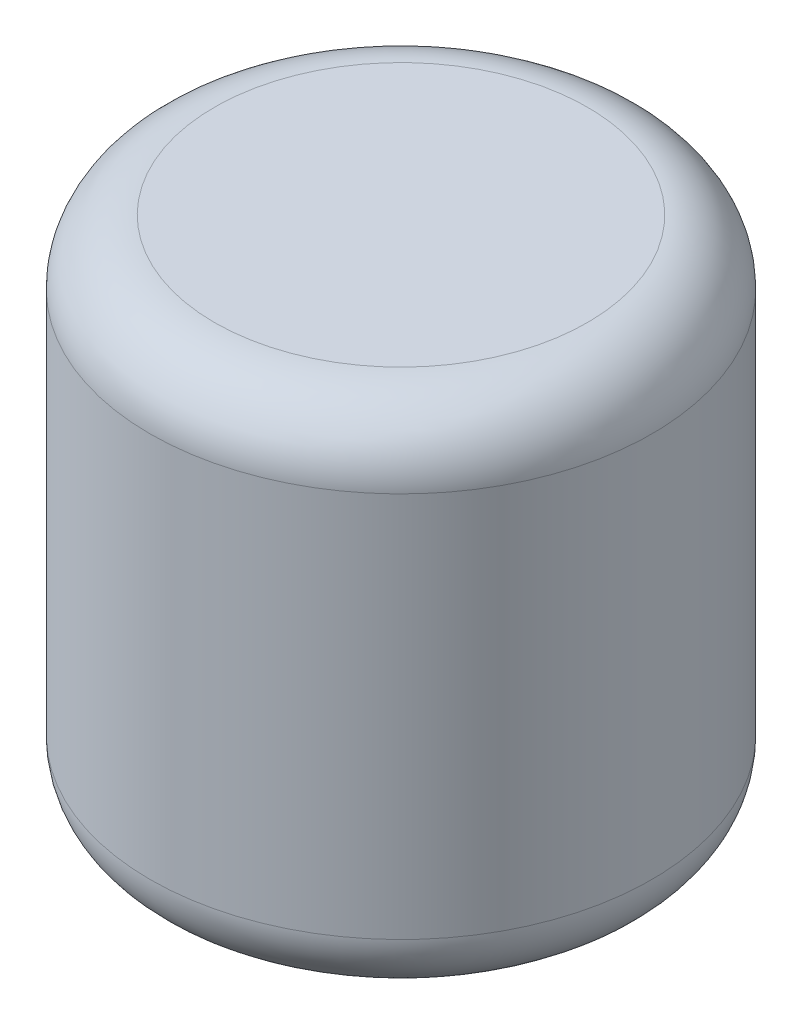
ISO-10303-21;
HEADER;
FILE_DESCRIPTION(('STEP AP214'),'2;1');
FILE_NAME('part.step','',(''),(''),'','','');
FILE_SCHEMA(('AUTOMOTIVE_DESIGN { 1 0 10303 214 1 1 1 1 }'));
ENDSEC;
DATA;
#1=APPLICATION_CONTEXT('core data for automotive mechanical design processes');
#2=APPLICATION_PROTOCOL_DEFINITION('international standard','automotive_design',2000,#1);
#3=PRODUCT_CONTEXT('',#1,'mechanical');
#4=PRODUCT('Part','Part','',(#3));
#5=PRODUCT_RELATED_PRODUCT_CATEGORY('part','',(#4));
#6=PRODUCT_DEFINITION_FORMATION('','',#4);
#7=PRODUCT_DEFINITION_CONTEXT('part definition',#1,'design');
#8=PRODUCT_DEFINITION('design','',#6,#7);
#9=PRODUCT_DEFINITION_SHAPE('','',#8);
#10=(LENGTH_UNIT() NAMED_UNIT(*) SI_UNIT(.MILLI.,.METRE.));
#11=(NAMED_UNIT(*) PLANE_ANGLE_UNIT() SI_UNIT($,.RADIAN.));
#12=(NAMED_UNIT(*) SI_UNIT($,.STERADIAN.) SOLID_ANGLE_UNIT());
#13=UNCERTAINTY_MEASURE_WITH_UNIT(LENGTH_MEASURE(1.E-05),#10,'distance_accuracy_value','');
#14=(GEOMETRIC_REPRESENTATION_CONTEXT(3) GLOBAL_UNCERTAINTY_ASSIGNED_CONTEXT((#13)) GLOBAL_UNIT_ASSIGNED_CONTEXT((#10,
#11,#12)) REPRESENTATION_CONTEXT('',''));
#15=CARTESIAN_POINT('',(0.,0.,0.));
#16=DIRECTION('',(0.,0.,1.));
#17=DIRECTION('',(1.,0.,0.));
#18=AXIS2_PLACEMENT_3D('',#15,#16,#17);
#19=CARTESIAN_POINT('',(0.,101.6,0.));
#20=DIRECTION('',(0.,-1.,0.));
#21=DIRECTION('',(0.,0.,-1.));
#22=AXIS2_PLACEMENT_3D('',#19,#20,#21);
#23=CYLINDRICAL_SURFACE('',#22,49.53);
#24=CARTESIAN_POINT('',(0.,12.7,0.));
#25=DIRECTION('',(0.,1.,0.));
#26=DIRECTION('',(0.,0.,1.));
#27=AXIS2_PLACEMENT_3D('',#24,#25,#26);
#28=CIRCLE('',#27,49.53);
#29=CARTESIAN_POINT('',(0.,12.7,49.53));
#30=VERTEX_POINT('',#29);
#31=EDGE_CURVE('E49',#30,#30,#28,.T.);
#32=ORIENTED_EDGE('',*,*,#31,.T.);
#33=EDGE_LOOP('',(#32));
#34=FACE_BOUND('',#33,.T.);
#35=CARTESIAN_POINT('',(0.,88.9,0.));
#36=DIRECTION('',(0.,1.,0.));
#37=DIRECTION('',(0.,0.,1.));
#38=AXIS2_PLACEMENT_3D('',#35,#36,#37);
#39=CIRCLE('',#38,49.53);
#40=CARTESIAN_POINT('',(0.,88.9,49.53));
#41=VERTEX_POINT('',#40);
#42=EDGE_CURVE('E53',#41,#41,#39,.F.);
#43=ORIENTED_EDGE('',*,*,#42,.T.);
#44=EDGE_LOOP('',(#43));
#45=FACE_BOUND('',#44,.T.);
#46=ADVANCED_FACE('F38',(#34,#45),#23,.T.);
#47=CARTESIAN_POINT('',(0.,101.6,0.));
#48=DIRECTION('',(0.,1.,0.));
#49=DIRECTION('',(0.,0.,1.));
#50=AXIS2_PLACEMENT_3D('',#47,#48,#49);
#51=PLANE('',#50);
#52=CARTESIAN_POINT('',(0.,101.6,0.));
#53=DIRECTION('',(0.,1.,0.));
#54=DIRECTION('',(0.,0.,1.));
#55=AXIS2_PLACEMENT_3D('',#52,#53,#54);
#56=CIRCLE('',#55,36.83);
#57=CARTESIAN_POINT('',(0.,101.6,36.83));
#58=VERTEX_POINT('',#57);
#59=EDGE_CURVE('E10',#58,#58,#56,.T.);
#60=ORIENTED_EDGE('',*,*,#59,.T.);
#61=EDGE_LOOP('',(#60));
#62=FACE_BOUND('',#61,.T.);
#63=ADVANCED_FACE('F69',(#62),#51,.T.);
#64=CARTESIAN_POINT('',(0.,0.,0.));
#65=DIRECTION('',(0.,1.,0.));
#66=DIRECTION('',(0.,0.,1.));
#67=AXIS2_PLACEMENT_3D('',#64,#65,#66);
#68=PLANE('',#67);
#69=CARTESIAN_POINT('',(0.,0.,0.));
#70=DIRECTION('',(0.,1.,0.));
#71=DIRECTION('',(0.,0.,1.));
#72=AXIS2_PLACEMENT_3D('',#69,#70,#71);
#73=CIRCLE('',#72,36.83);
#74=CARTESIAN_POINT('',(0.,0.,36.83));
#75=VERTEX_POINT('',#74);
#76=EDGE_CURVE('E45',#75,#75,#73,.F.);
#77=ORIENTED_EDGE('',*,*,#76,.T.);
#78=EDGE_LOOP('',(#77));
#79=FACE_BOUND('',#78,.T.);
#80=ADVANCED_FACE('F66',(#79),#68,.F.);
#81=CARTESIAN_POINT('',(0.,12.7,0.));
#82=DIRECTION('',(0.,1.,0.));
#83=DIRECTION('',(0.,0.,1.));
#84=AXIS2_PLACEMENT_3D('',#81,#82,#83);
#85=TOROIDAL_SURFACE('',#84,36.83,12.7);
#86=ORIENTED_EDGE('',*,*,#76,.F.);
#87=EDGE_LOOP('',(#86));
#88=FACE_BOUND('',#87,.T.);
#89=ORIENTED_EDGE('',*,*,#31,.F.);
#90=EDGE_LOOP('',(#89));
#91=FACE_BOUND('',#90,.T.);
#92=ADVANCED_FACE('F62',(#88,#91),#85,.T.);
#93=CARTESIAN_POINT('',(0.,88.9,0.));
#94=DIRECTION('',(0.,1.,0.));
#95=DIRECTION('',(0.,0.,1.));
#96=AXIS2_PLACEMENT_3D('',#93,#94,#95);
#97=TOROIDAL_SURFACE('',#96,36.83,12.7);
#98=ORIENTED_EDGE('',*,*,#42,.F.);
#99=EDGE_LOOP('',(#98));
#100=FACE_BOUND('',#99,.T.);
#101=ORIENTED_EDGE('',*,*,#59,.F.);
#102=EDGE_LOOP('',(#101));
#103=FACE_BOUND('',#102,.T.);
#104=ADVANCED_FACE('F40',(#100,#103),#97,.T.);
#105=CLOSED_SHELL('',(#46,#63,#80,#92,#104));
#106=MANIFOLD_SOLID_BREP('B2',#105);
#107=ADVANCED_BREP_SHAPE_REPRESENTATION('',(#18,#106),#14);
#108=SHAPE_DEFINITION_REPRESENTATION(#9,#107);
ENDSEC;
END-ISO-10303-21;
